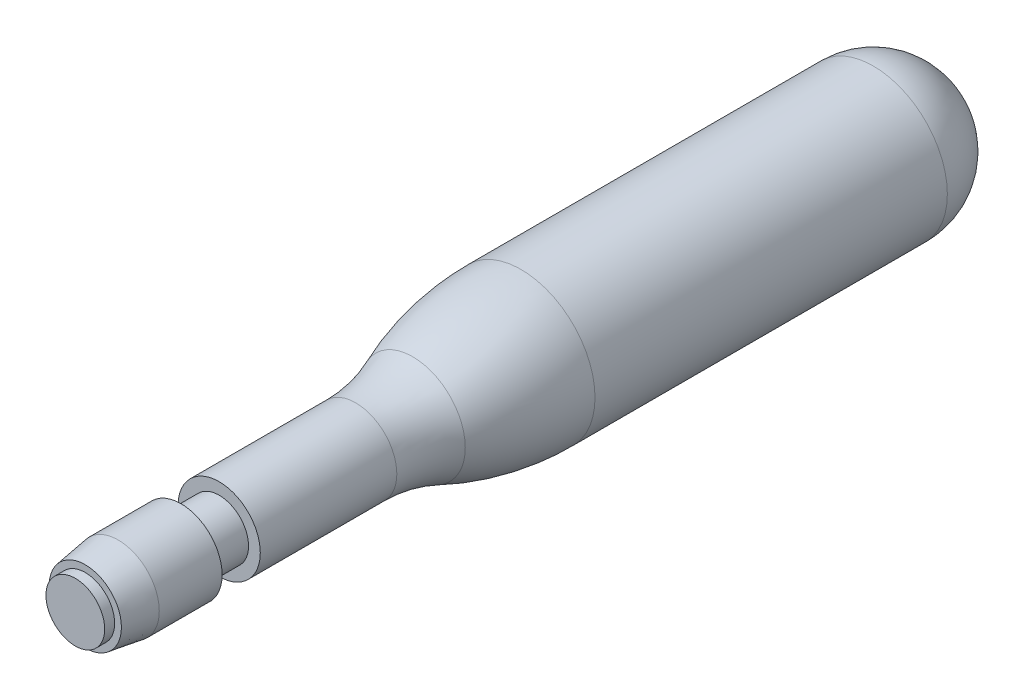
ISO-10303-21;
HEADER;
FILE_DESCRIPTION(('STEP AP214'),'2;1');
FILE_NAME('part.step','',(''),(''),'','','');
FILE_SCHEMA(('AUTOMOTIVE_DESIGN { 1 0 10303 214 1 1 1 1 }'));
ENDSEC;
DATA;
#1=APPLICATION_CONTEXT('core data for automotive mechanical design processes');
#2=APPLICATION_PROTOCOL_DEFINITION('international standard','automotive_design',2000,#1);
#3=PRODUCT_CONTEXT('',#1,'mechanical');
#4=PRODUCT('Part','Part','',(#3));
#5=PRODUCT_RELATED_PRODUCT_CATEGORY('part','',(#4));
#6=PRODUCT_DEFINITION_FORMATION('','',#4);
#7=PRODUCT_DEFINITION_CONTEXT('part definition',#1,'design');
#8=PRODUCT_DEFINITION('design','',#6,#7);
#9=PRODUCT_DEFINITION_SHAPE('','',#8);
#10=(LENGTH_UNIT() NAMED_UNIT(*) SI_UNIT(.MILLI.,.METRE.));
#11=(NAMED_UNIT(*) PLANE_ANGLE_UNIT() SI_UNIT($,.RADIAN.));
#12=(NAMED_UNIT(*) SI_UNIT($,.STERADIAN.) SOLID_ANGLE_UNIT());
#13=UNCERTAINTY_MEASURE_WITH_UNIT(LENGTH_MEASURE(1.E-05),#10,'distance_accuracy_value','');
#14=(GEOMETRIC_REPRESENTATION_CONTEXT(3) GLOBAL_UNCERTAINTY_ASSIGNED_CONTEXT((#13)) GLOBAL_UNIT_ASSIGNED_CONTEXT((#10,
#11,#12)) REPRESENTATION_CONTEXT('',''));
#15=CARTESIAN_POINT('',(0.,0.,0.));
#16=DIRECTION('',(0.,0.,1.));
#17=DIRECTION('',(1.,0.,0.));
#18=AXIS2_PLACEMENT_3D('',#15,#16,#17);
#19=CARTESIAN_POINT('',(5.,0.,0.));
#20=DIRECTION('',(0.,0.,1.));
#21=DIRECTION('',(1.,0.,0.));
#22=AXIS2_PLACEMENT_3D('',#19,#20,#21);
#23=PLANE('',#22);
#24=CARTESIAN_POINT('',(0.,0.,0.));
#25=DIRECTION('',(0.,0.,1.));
#26=DIRECTION('',(1.,0.,0.));
#27=AXIS2_PLACEMENT_3D('',#24,#25,#26);
#28=CIRCLE('',#27,5.);
#29=CARTESIAN_POINT('',(5.,0.,0.));
#30=VERTEX_POINT('',#29);
#31=EDGE_CURVE('E71',#30,#30,#28,.T.);
#32=ORIENTED_EDGE('',*,*,#31,.T.);
#33=EDGE_LOOP('',(#32));
#34=FACE_BOUND('',#33,.T.);
#35=ADVANCED_FACE('F31',(#34),#23,.T.);
#36=CARTESIAN_POINT('',(0.,0.,-135.9));
#37=DIRECTION('',(0.,0.,1.));
#38=DIRECTION('',(1.,0.,0.));
#39=AXIS2_PLACEMENT_3D('',#36,#37,#38);
#40=SPHERICAL_SURFACE('',#39,12.6);
#41=CARTESIAN_POINT('',(0.,0.,-135.9));
#42=DIRECTION('',(0.,0.,1.));
#43=DIRECTION('',(1.,0.,0.));
#44=AXIS2_PLACEMENT_3D('',#41,#42,#43);
#45=CIRCLE('',#44,12.6);
#46=CARTESIAN_POINT('',(12.6,0.,-135.9));
#47=VERTEX_POINT('',#46);
#48=EDGE_CURVE('E10',#47,#47,#45,.T.);
#49=ORIENTED_EDGE('',*,*,#48,.F.);
#50=EDGE_LOOP('',(#49));
#51=FACE_BOUND('',#50,.T.);
#52=ADVANCED_FACE('F88',(#51),#40,.T.);
#53=CARTESIAN_POINT('',(0.,0.,0.));
#54=DIRECTION('',(0.,0.,1.));
#55=DIRECTION('',(1.,0.,0.));
#56=AXIS2_PLACEMENT_3D('',#53,#54,#55);
#57=CYLINDRICAL_SURFACE('',#56,12.6);
#58=ORIENTED_EDGE('',*,*,#48,.T.);
#59=EDGE_LOOP('',(#58));
#60=FACE_BOUND('',#59,.T.);
#61=CARTESIAN_POINT('',(0.,0.,-75.9));
#62=DIRECTION('',(0.,0.,1.));
#63=DIRECTION('',(1.,0.,0.));
#64=AXIS2_PLACEMENT_3D('',#61,#62,#63);
#65=CIRCLE('',#64,12.6);
#66=CARTESIAN_POINT('',(12.6,0.,-75.9));
#67=VERTEX_POINT('',#66);
#68=EDGE_CURVE('E37',#67,#67,#65,.T.);
#69=ORIENTED_EDGE('',*,*,#68,.F.);
#70=EDGE_LOOP('',(#69));
#71=FACE_BOUND('',#70,.T.);
#72=ADVANCED_FACE('F92',(#60,#71),#57,.T.);
#73=CARTESIAN_POINT('',(0.,0.,-75.9));
#74=DIRECTION('',(0.,0.,1.));
#75=DIRECTION('',(1.,0.,0.));
#76=AXIS2_PLACEMENT_3D('',#73,#74,#75);
#77=DEGENERATE_TOROIDAL_SURFACE('',#76,35.5520089285711,48.1520089285711,.F.);
#78=ORIENTED_EDGE('',*,*,#68,.T.);
#79=EDGE_LOOP('',(#78));
#80=FACE_BOUND('',#79,.T.);
#81=CARTESIAN_POINT('',(0.,0.,-57.471148482761));
#82=DIRECTION('',(0.,0.,1.));
#83=DIRECTION('',(1.,0.,0.));
#84=AXIS2_PLACEMENT_3D('',#81,#82,#83);
#85=CIRCLE('',#84,8.93386968040714);
#86=CARTESIAN_POINT('',(8.93386968040714,0.,-57.471148482761));
#87=VERTEX_POINT('',#86);
#88=EDGE_CURVE('E41',#87,#87,#85,.T.);
#89=ORIENTED_EDGE('',*,*,#88,.F.);
#90=EDGE_LOOP('',(#89));
#91=FACE_BOUND('',#90,.T.);
#92=ADVANCED_FACE('F97',(#80,#91),#77,.F.);
#93=CARTESIAN_POINT('',(0.,0.,-47.75));
#94=DIRECTION('',(0.,0.,1.));
#95=DIRECTION('',(1.,0.,0.));
#96=AXIS2_PLACEMENT_3D('',#93,#94,#95);
#97=TOROIDAL_SURFACE('',#96,32.4,25.4);
#98=ORIENTED_EDGE('',*,*,#88,.T.);
#99=EDGE_LOOP('',(#98));
#100=FACE_BOUND('',#99,.T.);
#101=CARTESIAN_POINT('',(0.,0.,-47.75));
#102=DIRECTION('',(0.,0.,1.));
#103=DIRECTION('',(1.,0.,0.));
#104=AXIS2_PLACEMENT_3D('',#101,#102,#103);
#105=CIRCLE('',#104,7.);
#106=CARTESIAN_POINT('',(7.,0.,-47.75));
#107=VERTEX_POINT('',#106);
#108=EDGE_CURVE('E45',#107,#107,#105,.T.);
#109=ORIENTED_EDGE('',*,*,#108,.F.);
#110=EDGE_LOOP('',(#109));
#111=FACE_BOUND('',#110,.T.);
#112=ADVANCED_FACE('F102',(#100,#111),#97,.F.);
#113=CARTESIAN_POINT('',(0.,0.,0.));
#114=DIRECTION('',(0.,0.,1.));
#115=DIRECTION('',(1.,0.,0.));
#116=AXIS2_PLACEMENT_3D('',#113,#114,#115);
#117=CYLINDRICAL_SURFACE('',#116,7.);
#118=ORIENTED_EDGE('',*,*,#108,.T.);
#119=EDGE_LOOP('',(#118));
#120=FACE_BOUND('',#119,.T.);
#121=CARTESIAN_POINT('',(0.,0.,-24.5));
#122=DIRECTION('',(0.,0.,1.));
#123=DIRECTION('',(1.,0.,0.));
#124=AXIS2_PLACEMENT_3D('',#121,#122,#123);
#125=CIRCLE('',#124,7.);
#126=CARTESIAN_POINT('',(7.,0.,-24.5));
#127=VERTEX_POINT('',#126);
#128=EDGE_CURVE('E50',#127,#127,#125,.T.);
#129=ORIENTED_EDGE('',*,*,#128,.F.);
#130=EDGE_LOOP('',(#129));
#131=FACE_BOUND('',#130,.T.);
#132=ADVANCED_FACE('F105',(#120,#131),#117,.T.);
#133=CARTESIAN_POINT('',(7.,0.,-24.5));
#134=DIRECTION('',(0.,0.,1.));
#135=DIRECTION('',(1.,0.,0.));
#136=AXIS2_PLACEMENT_3D('',#133,#134,#135);
#137=PLANE('',#136);
#138=ORIENTED_EDGE('',*,*,#128,.T.);
#139=EDGE_LOOP('',(#138));
#140=FACE_BOUND('',#139,.T.);
#141=CARTESIAN_POINT('',(0.,0.,-24.5));
#142=DIRECTION('',(0.,0.,1.));
#143=DIRECTION('',(1.,0.,0.));
#144=AXIS2_PLACEMENT_3D('',#141,#142,#143);
#145=CIRCLE('',#144,5.);
#146=CARTESIAN_POINT('',(5.,0.,-24.5));
#147=VERTEX_POINT('',#146);
#148=EDGE_CURVE('E53',#147,#147,#145,.T.);
#149=ORIENTED_EDGE('',*,*,#148,.F.);
#150=EDGE_LOOP('',(#149));
#151=FACE_BOUND('',#150,.T.);
#152=ADVANCED_FACE('F109',(#140,#151),#137,.T.);
#153=CARTESIAN_POINT('',(0.,0.,0.));
#154=DIRECTION('',(0.,0.,1.));
#155=DIRECTION('',(1.,0.,0.));
#156=AXIS2_PLACEMENT_3D('',#153,#154,#155);
#157=CYLINDRICAL_SURFACE('',#156,5.);
#158=ORIENTED_EDGE('',*,*,#148,.T.);
#159=EDGE_LOOP('',(#158));
#160=FACE_BOUND('',#159,.T.);
#161=CARTESIAN_POINT('',(0.,0.,-18.));
#162=DIRECTION('',(0.,0.,1.));
#163=DIRECTION('',(1.,0.,0.));
#164=AXIS2_PLACEMENT_3D('',#161,#162,#163);
#165=CIRCLE('',#164,5.);
#166=CARTESIAN_POINT('',(5.,0.,-18.));
#167=VERTEX_POINT('',#166);
#168=EDGE_CURVE('E56',#167,#167,#165,.T.);
#169=ORIENTED_EDGE('',*,*,#168,.F.);
#170=EDGE_LOOP('',(#169));
#171=FACE_BOUND('',#170,.T.);
#172=ADVANCED_FACE('F113',(#160,#171),#157,.T.);
#173=CARTESIAN_POINT('',(5.,0.,-18.));
#174=DIRECTION('',(0.,0.,-1.));
#175=DIRECTION('',(-1.,0.,0.));
#176=AXIS2_PLACEMENT_3D('',#173,#174,#175);
#177=PLANE('',#176);
#178=ORIENTED_EDGE('',*,*,#168,.T.);
#179=EDGE_LOOP('',(#178));
#180=FACE_BOUND('',#179,.T.);
#181=CARTESIAN_POINT('',(0.,0.,-18.));
#182=DIRECTION('',(0.,0.,1.));
#183=DIRECTION('',(1.,0.,0.));
#184=AXIS2_PLACEMENT_3D('',#181,#182,#183);
#185=CIRCLE('',#184,7.);
#186=CARTESIAN_POINT('',(7.,0.,-18.));
#187=VERTEX_POINT('',#186);
#188=EDGE_CURVE('E59',#187,#187,#185,.T.);
#189=ORIENTED_EDGE('',*,*,#188,.F.);
#190=EDGE_LOOP('',(#189));
#191=FACE_BOUND('',#190,.T.);
#192=ADVANCED_FACE('F117',(#180,#191),#177,.T.);
#193=CARTESIAN_POINT('',(0.,0.,0.));
#194=DIRECTION('',(0.,0.,1.));
#195=DIRECTION('',(1.,0.,0.));
#196=AXIS2_PLACEMENT_3D('',#193,#194,#195);
#197=CYLINDRICAL_SURFACE('',#196,7.);
#198=ORIENTED_EDGE('',*,*,#188,.T.);
#199=EDGE_LOOP('',(#198));
#200=FACE_BOUND('',#199,.T.);
#201=CARTESIAN_POINT('',(0.,0.,-7.3));
#202=DIRECTION('',(0.,0.,1.));
#203=DIRECTION('',(1.,0.,0.));
#204=AXIS2_PLACEMENT_3D('',#201,#202,#203);
#205=CIRCLE('',#204,7.);
#206=CARTESIAN_POINT('',(7.,0.,-7.3));
#207=VERTEX_POINT('',#206);
#208=EDGE_CURVE('E62',#207,#207,#205,.T.);
#209=ORIENTED_EDGE('',*,*,#208,.F.);
#210=EDGE_LOOP('',(#209));
#211=FACE_BOUND('',#210,.T.);
#212=ADVANCED_FACE('F121',(#200,#211),#197,.T.);
#213=CARTESIAN_POINT('',(0.,0.,-1.7));
#214=DIRECTION('',(0.,0.,-1.));
#215=DIRECTION('',(-1.,0.,0.));
#216=AXIS2_PLACEMENT_3D('',#213,#214,#215);
#217=CONICAL_SURFACE('',#216,6.15,0.150635908297186);
#218=ORIENTED_EDGE('',*,*,#208,.T.);
#219=EDGE_LOOP('',(#218));
#220=FACE_BOUND('',#219,.T.);
#221=CARTESIAN_POINT('',(0.,0.,-1.7));
#222=DIRECTION('',(0.,0.,1.));
#223=DIRECTION('',(1.,0.,0.));
#224=AXIS2_PLACEMENT_3D('',#221,#222,#223);
#225=CIRCLE('',#224,6.15);
#226=CARTESIAN_POINT('',(6.15,0.,-1.7));
#227=VERTEX_POINT('',#226);
#228=EDGE_CURVE('E65',#227,#227,#225,.T.);
#229=ORIENTED_EDGE('',*,*,#228,.F.);
#230=EDGE_LOOP('',(#229));
#231=FACE_BOUND('',#230,.T.);
#232=ADVANCED_FACE('F84',(#220,#231),#217,.T.);
#233=CARTESIAN_POINT('',(6.15,0.,-1.7));
#234=DIRECTION('',(0.,0.,1.));
#235=DIRECTION('',(1.,0.,0.));
#236=AXIS2_PLACEMENT_3D('',#233,#234,#235);
#237=PLANE('',#236);
#238=ORIENTED_EDGE('',*,*,#228,.T.);
#239=EDGE_LOOP('',(#238));
#240=FACE_BOUND('',#239,.T.);
#241=CARTESIAN_POINT('',(0.,0.,-1.7));
#242=DIRECTION('',(0.,0.,1.));
#243=DIRECTION('',(1.,0.,0.));
#244=AXIS2_PLACEMENT_3D('',#241,#242,#243);
#245=CIRCLE('',#244,5.);
#246=CARTESIAN_POINT('',(5.,0.,-1.7));
#247=VERTEX_POINT('',#246);
#248=EDGE_CURVE('E68',#247,#247,#245,.T.);
#249=ORIENTED_EDGE('',*,*,#248,.F.);
#250=EDGE_LOOP('',(#249));
#251=FACE_BOUND('',#250,.T.);
#252=ADVANCED_FACE('F78',(#240,#251),#237,.T.);
#253=CARTESIAN_POINT('',(0.,0.,0.));
#254=DIRECTION('',(0.,0.,1.));
#255=DIRECTION('',(1.,0.,0.));
#256=AXIS2_PLACEMENT_3D('',#253,#254,#255);
#257=CYLINDRICAL_SURFACE('',#256,5.);
#258=ORIENTED_EDGE('',*,*,#248,.T.);
#259=EDGE_LOOP('',(#258));
#260=FACE_BOUND('',#259,.T.);
#261=ORIENTED_EDGE('',*,*,#31,.F.);
#262=EDGE_LOOP('',(#261));
#263=FACE_BOUND('',#262,.T.);
#264=ADVANCED_FACE('F76',(#260,#263),#257,.T.);
#265=CLOSED_SHELL('',(#35,#52,#72,#92,#112,#132,#152,#172,#192,#212,#232,#252,#264));
#266=MANIFOLD_SOLID_BREP('B2',#265);
#267=ADVANCED_BREP_SHAPE_REPRESENTATION('',(#18,#266),#14);
#268=SHAPE_DEFINITION_REPRESENTATION(#9,#267);
ENDSEC;
END-ISO-10303-21;
